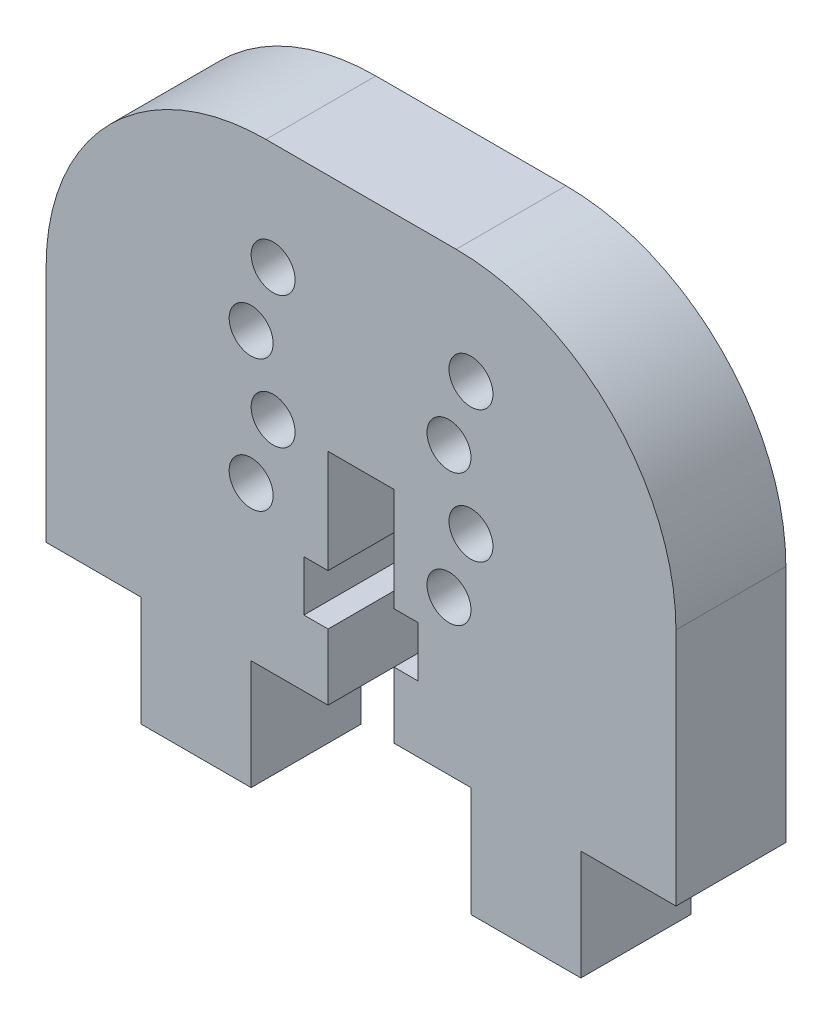
ISO-10303-21;
HEADER;
FILE_DESCRIPTION(('STEP AP214'),'2;1');
FILE_NAME('part.step','',(''),(''),'','','');
FILE_SCHEMA(('AUTOMOTIVE_DESIGN { 1 0 10303 214 1 1 1 1 }'));
ENDSEC;
DATA;
#1=APPLICATION_CONTEXT('core data for automotive mechanical design processes');
#2=APPLICATION_PROTOCOL_DEFINITION('international standard','automotive_design',2000,#1);
#3=PRODUCT_CONTEXT('',#1,'mechanical');
#4=PRODUCT('Part','Part','',(#3));
#5=PRODUCT_RELATED_PRODUCT_CATEGORY('part','',(#4));
#6=PRODUCT_DEFINITION_FORMATION('','',#4);
#7=PRODUCT_DEFINITION_CONTEXT('part definition',#1,'design');
#8=PRODUCT_DEFINITION('design','',#6,#7);
#9=PRODUCT_DEFINITION_SHAPE('','',#8);
#10=(LENGTH_UNIT() NAMED_UNIT(*) SI_UNIT(.MILLI.,.METRE.));
#11=(NAMED_UNIT(*) PLANE_ANGLE_UNIT() SI_UNIT($,.RADIAN.));
#12=(NAMED_UNIT(*) SI_UNIT($,.STERADIAN.) SOLID_ANGLE_UNIT());
#13=UNCERTAINTY_MEASURE_WITH_UNIT(LENGTH_MEASURE(1.E-05),#10,'distance_accuracy_value','');
#14=(GEOMETRIC_REPRESENTATION_CONTEXT(3) GLOBAL_UNCERTAINTY_ASSIGNED_CONTEXT((#13)) GLOBAL_UNIT_ASSIGNED_CONTEXT((#10,
#11,#12)) REPRESENTATION_CONTEXT('',''));
#15=CARTESIAN_POINT('',(0.,0.,0.));
#16=DIRECTION('',(0.,0.,1.));
#17=DIRECTION('',(1.,0.,0.));
#18=AXIS2_PLACEMENT_3D('',#15,#16,#17);
#19=CARTESIAN_POINT('',(-1.5,0.,5.));
#20=DIRECTION('',(1.,0.,0.));
#21=DIRECTION('',(0.,1.,0.));
#22=AXIS2_PLACEMENT_3D('',#19,#20,#21);
#23=PLANE('',#22);
#24=DIRECTION('',(0.,-1.,0.));
#25=VECTOR('',#24,1.);
#26=CARTESIAN_POINT('',(-1.5,0.,0.));
#27=LINE('',#26,#25);
#28=CARTESIAN_POINT('',(-1.5,-7.43799709001882,0.));
#29=VERTEX_POINT('',#28);
#30=CARTESIAN_POINT('',(-1.5,-10.4379970900188,0.));
#31=VERTEX_POINT('',#30);
#32=EDGE_CURVE('E214',#29,#31,#27,.T.);
#33=ORIENTED_EDGE('',*,*,#32,.F.);
#34=DIRECTION('',(0.,0.,-1.));
#35=VECTOR('',#34,1.);
#36=CARTESIAN_POINT('',(-1.5,-7.43799709001882,5.));
#37=LINE('',#36,#35);
#38=CARTESIAN_POINT('',(-1.5,-7.43799709001882,5.));
#39=VERTEX_POINT('',#38);
#40=EDGE_CURVE('E209',#39,#29,#37,.T.);
#41=ORIENTED_EDGE('',*,*,#40,.F.);
#42=DIRECTION('',(0.,-1.,0.));
#43=VECTOR('',#42,1.);
#44=CARTESIAN_POINT('',(-1.5,0.,5.));
#45=LINE('',#44,#43);
#46=CARTESIAN_POINT('',(-1.5,-10.4379970900188,5.));
#47=VERTEX_POINT('',#46);
#48=EDGE_CURVE('E212',#39,#47,#45,.T.);
#49=ORIENTED_EDGE('',*,*,#48,.T.);
#50=DIRECTION('',(0.,0.,-1.));
#51=VECTOR('',#50,1.);
#52=CARTESIAN_POINT('',(-1.5,-10.4379970900188,5.));
#53=LINE('',#52,#51);
#54=EDGE_CURVE('E308',#47,#31,#53,.T.);
#55=ORIENTED_EDGE('',*,*,#54,.T.);
#56=EDGE_LOOP('',(#33,#41,#49,#55));
#57=FACE_BOUND('',#56,.T.);
#58=ADVANCED_FACE('F32',(#57),#23,.T.);
#59=CARTESIAN_POINT('',(0.,-7.43799709001883,5.));
#60=DIRECTION('',(0.,-1.,0.));
#61=DIRECTION('',(1.,0.,0.));
#62=AXIS2_PLACEMENT_3D('',#59,#60,#61);
#63=PLANE('',#62);
#64=DIRECTION('',(-1.,0.,0.));
#65=VECTOR('',#64,1.);
#66=CARTESIAN_POINT('',(0.,-7.43799709001883,0.));
#67=LINE('',#66,#65);
#68=CARTESIAN_POINT('',(-2.6,-7.43799709001882,0.));
#69=VERTEX_POINT('',#68);
#70=EDGE_CURVE('E310',#29,#69,#67,.T.);
#71=ORIENTED_EDGE('',*,*,#70,.T.);
#72=DIRECTION('',(0.,0.,-1.));
#73=VECTOR('',#72,1.);
#74=CARTESIAN_POINT('',(-2.6,-7.43799709001882,5.));
#75=LINE('',#74,#73);
#76=CARTESIAN_POINT('',(-2.6,-7.43799709001882,5.));
#77=VERTEX_POINT('',#76);
#78=EDGE_CURVE('E218',#77,#69,#75,.T.);
#79=ORIENTED_EDGE('',*,*,#78,.F.);
#80=DIRECTION('',(-1.,0.,0.));
#81=VECTOR('',#80,1.);
#82=CARTESIAN_POINT('',(0.,-7.43799709001883,5.));
#83=LINE('',#82,#81);
#84=EDGE_CURVE('E221',#39,#77,#83,.T.);
#85=ORIENTED_EDGE('',*,*,#84,.F.);
#86=ORIENTED_EDGE('',*,*,#40,.T.);
#87=EDGE_LOOP('',(#71,#79,#85,#86));
#88=FACE_BOUND('',#87,.T.);
#89=ADVANCED_FACE('F222',(#88),#63,.F.);
#90=CARTESIAN_POINT('',(-2.60000000000001,0.,5.));
#91=DIRECTION('',(-1.,0.,0.));
#92=DIRECTION('',(0.,-1.,0.));
#93=AXIS2_PLACEMENT_3D('',#90,#91,#92);
#94=PLANE('',#93);
#95=DIRECTION('',(0.,1.,0.));
#96=VECTOR('',#95,1.);
#97=CARTESIAN_POINT('',(-2.60000000000001,0.,0.));
#98=LINE('',#97,#96);
#99=CARTESIAN_POINT('',(-2.6,-5.13799709001883,0.));
#100=VERTEX_POINT('',#99);
#101=EDGE_CURVE('E312',#69,#100,#98,.T.);
#102=ORIENTED_EDGE('',*,*,#101,.T.);
#103=DIRECTION('',(0.,0.,-1.));
#104=VECTOR('',#103,1.);
#105=CARTESIAN_POINT('',(-2.6,-5.13799709001883,5.));
#106=LINE('',#105,#104);
#107=CARTESIAN_POINT('',(-2.6,-5.13799709001883,5.));
#108=VERTEX_POINT('',#107);
#109=EDGE_CURVE('E428',#108,#100,#106,.T.);
#110=ORIENTED_EDGE('',*,*,#109,.F.);
#111=DIRECTION('',(0.,1.,0.));
#112=VECTOR('',#111,1.);
#113=CARTESIAN_POINT('',(-2.60000000000001,0.,5.));
#114=LINE('',#113,#112);
#115=EDGE_CURVE('E225',#77,#108,#114,.T.);
#116=ORIENTED_EDGE('',*,*,#115,.F.);
#117=ORIENTED_EDGE('',*,*,#78,.T.);
#118=EDGE_LOOP('',(#102,#110,#116,#117));
#119=FACE_BOUND('',#118,.T.);
#120=ADVANCED_FACE('F474',(#119),#94,.F.);
#121=CARTESIAN_POINT('',(0.,-5.13799709001884,5.));
#122=DIRECTION('',(0.,1.,0.));
#123=DIRECTION('',(-1.,0.,0.));
#124=AXIS2_PLACEMENT_3D('',#121,#122,#123);
#125=PLANE('',#124);
#126=DIRECTION('',(1.,0.,0.));
#127=VECTOR('',#126,1.);
#128=CARTESIAN_POINT('',(0.,-5.13799709001884,0.));
#129=LINE('',#128,#127);
#130=CARTESIAN_POINT('',(-1.5,-5.13799709001883,0.));
#131=VERTEX_POINT('',#130);
#132=EDGE_CURVE('E314',#100,#131,#129,.T.);
#133=ORIENTED_EDGE('',*,*,#132,.T.);
#134=DIRECTION('',(0.,0.,-1.));
#135=VECTOR('',#134,1.);
#136=CARTESIAN_POINT('',(-1.5,-5.13799709001883,5.));
#137=LINE('',#136,#135);
#138=CARTESIAN_POINT('',(-1.5,-5.13799709001883,5.));
#139=VERTEX_POINT('',#138);
#140=EDGE_CURVE('E426',#139,#131,#137,.T.);
#141=ORIENTED_EDGE('',*,*,#140,.F.);
#142=DIRECTION('',(1.,0.,0.));
#143=VECTOR('',#142,1.);
#144=CARTESIAN_POINT('',(0.,-5.13799709001884,5.));
#145=LINE('',#144,#143);
#146=EDGE_CURVE('E239',#108,#139,#145,.T.);
#147=ORIENTED_EDGE('',*,*,#146,.F.);
#148=ORIENTED_EDGE('',*,*,#109,.T.);
#149=EDGE_LOOP('',(#133,#141,#147,#148));
#150=FACE_BOUND('',#149,.T.);
#151=ADVANCED_FACE('F481',(#150),#125,.F.);
#152=CARTESIAN_POINT('',(-1.5,0.,5.));
#153=DIRECTION('',(1.,0.,0.));
#154=DIRECTION('',(0.,1.,0.));
#155=AXIS2_PLACEMENT_3D('',#152,#153,#154);
#156=PLANE('',#155);
#157=DIRECTION('',(0.,-1.,0.));
#158=VECTOR('',#157,1.);
#159=CARTESIAN_POINT('',(-1.5,0.,0.));
#160=LINE('',#159,#158);
#161=CARTESIAN_POINT('',(-1.5,-0.437997090018828,0.));
#162=VERTEX_POINT('',#161);
#163=EDGE_CURVE('E317',#162,#131,#160,.T.);
#164=ORIENTED_EDGE('',*,*,#163,.F.);
#165=DIRECTION('',(0.,0.,-1.));
#166=VECTOR('',#165,1.);
#167=CARTESIAN_POINT('',(-1.5,-0.437997090018828,5.));
#168=LINE('',#167,#166);
#169=CARTESIAN_POINT('',(-1.5,-0.437997090018828,5.));
#170=VERTEX_POINT('',#169);
#171=EDGE_CURVE('E424',#170,#162,#168,.T.);
#172=ORIENTED_EDGE('',*,*,#171,.F.);
#173=DIRECTION('',(0.,-1.,0.));
#174=VECTOR('',#173,1.);
#175=CARTESIAN_POINT('',(-1.5,0.,5.));
#176=LINE('',#175,#174);
#177=EDGE_CURVE('E241',#170,#139,#176,.T.);
#178=ORIENTED_EDGE('',*,*,#177,.T.);
#179=ORIENTED_EDGE('',*,*,#140,.T.);
#180=EDGE_LOOP('',(#164,#172,#178,#179));
#181=FACE_BOUND('',#180,.T.);
#182=ADVANCED_FACE('F484',(#181),#156,.T.);
#183=CARTESIAN_POINT('',(0.,-0.437997090018828,5.));
#184=DIRECTION('',(0.,-1.,0.));
#185=DIRECTION('',(0.,0.,-1.));
#186=AXIS2_PLACEMENT_3D('',#183,#184,#185);
#187=PLANE('',#186);
#188=DIRECTION('',(-1.,0.,0.));
#189=VECTOR('',#188,1.);
#190=CARTESIAN_POINT('',(0.,-0.437997090018828,0.));
#191=LINE('',#190,#189);
#192=CARTESIAN_POINT('',(1.49999999999999,-0.437997090018828,0.));
#193=VERTEX_POINT('',#192);
#194=EDGE_CURVE('E320',#193,#162,#191,.T.);
#195=ORIENTED_EDGE('',*,*,#194,.F.);
#196=DIRECTION('',(0.,0.,-1.));
#197=VECTOR('',#196,1.);
#198=CARTESIAN_POINT('',(1.49999999999999,-0.437997090018828,5.));
#199=LINE('',#198,#197);
#200=CARTESIAN_POINT('',(1.49999999999999,-0.437997090018828,5.));
#201=VERTEX_POINT('',#200);
#202=EDGE_CURVE('E422',#201,#193,#199,.T.);
#203=ORIENTED_EDGE('',*,*,#202,.F.);
#204=DIRECTION('',(-1.,0.,0.));
#205=VECTOR('',#204,1.);
#206=CARTESIAN_POINT('',(0.,-0.437997090018828,5.));
#207=LINE('',#206,#205);
#208=EDGE_CURVE('E244',#201,#170,#207,.T.);
#209=ORIENTED_EDGE('',*,*,#208,.T.);
#210=ORIENTED_EDGE('',*,*,#171,.T.);
#211=EDGE_LOOP('',(#195,#203,#209,#210));
#212=FACE_BOUND('',#211,.T.);
#213=ADVANCED_FACE('F487',(#212),#187,.T.);
#214=CARTESIAN_POINT('',(1.5,0.,5.));
#215=DIRECTION('',(-1.,0.,0.));
#216=DIRECTION('',(0.,-1.,0.));
#217=AXIS2_PLACEMENT_3D('',#214,#215,#216);
#218=PLANE('',#217);
#219=DIRECTION('',(0.,1.,0.));
#220=VECTOR('',#219,1.);
#221=CARTESIAN_POINT('',(1.5,0.,0.));
#222=LINE('',#221,#220);
#223=CARTESIAN_POINT('',(1.49999999999999,-5.13799709001883,0.));
#224=VERTEX_POINT('',#223);
#225=EDGE_CURVE('E323',#224,#193,#222,.T.);
#226=ORIENTED_EDGE('',*,*,#225,.F.);
#227=DIRECTION('',(0.,0.,-1.));
#228=VECTOR('',#227,1.);
#229=CARTESIAN_POINT('',(1.49999999999999,-5.13799709001883,5.));
#230=LINE('',#229,#228);
#231=CARTESIAN_POINT('',(1.49999999999999,-5.13799709001883,5.));
#232=VERTEX_POINT('',#231);
#233=EDGE_CURVE('E420',#232,#224,#230,.T.);
#234=ORIENTED_EDGE('',*,*,#233,.F.);
#235=DIRECTION('',(0.,1.,0.));
#236=VECTOR('',#235,1.);
#237=CARTESIAN_POINT('',(1.5,0.,5.));
#238=LINE('',#237,#236);
#239=EDGE_CURVE('E247',#232,#201,#238,.T.);
#240=ORIENTED_EDGE('',*,*,#239,.T.);
#241=ORIENTED_EDGE('',*,*,#202,.T.);
#242=EDGE_LOOP('',(#226,#234,#240,#241));
#243=FACE_BOUND('',#242,.T.);
#244=ADVANCED_FACE('F491',(#243),#218,.T.);
#245=CARTESIAN_POINT('',(0.,-5.13799709001884,5.));
#246=DIRECTION('',(0.,1.,0.));
#247=DIRECTION('',(-1.,0.,0.));
#248=AXIS2_PLACEMENT_3D('',#245,#246,#247);
#249=PLANE('',#248);
#250=DIRECTION('',(1.,0.,0.));
#251=VECTOR('',#250,1.);
#252=CARTESIAN_POINT('',(0.,-5.13799709001884,0.));
#253=LINE('',#252,#251);
#254=CARTESIAN_POINT('',(2.6,-5.13799709001883,0.));
#255=VERTEX_POINT('',#254);
#256=EDGE_CURVE('E326',#224,#255,#253,.T.);
#257=ORIENTED_EDGE('',*,*,#256,.T.);
#258=DIRECTION('',(0.,0.,-1.));
#259=VECTOR('',#258,1.);
#260=CARTESIAN_POINT('',(2.6,-5.13799709001883,5.));
#261=LINE('',#260,#259);
#262=CARTESIAN_POINT('',(2.6,-5.13799709001883,5.));
#263=VERTEX_POINT('',#262);
#264=EDGE_CURVE('E417',#263,#255,#261,.T.);
#265=ORIENTED_EDGE('',*,*,#264,.F.);
#266=DIRECTION('',(1.,0.,0.));
#267=VECTOR('',#266,1.);
#268=CARTESIAN_POINT('',(0.,-5.13799709001884,5.));
#269=LINE('',#268,#267);
#270=EDGE_CURVE('E250',#232,#263,#269,.T.);
#271=ORIENTED_EDGE('',*,*,#270,.F.);
#272=ORIENTED_EDGE('',*,*,#233,.T.);
#273=EDGE_LOOP('',(#257,#265,#271,#272));
#274=FACE_BOUND('',#273,.T.);
#275=ADVANCED_FACE('F496',(#274),#249,.F.);
#276=CARTESIAN_POINT('',(2.6,0.,5.));
#277=DIRECTION('',(1.,0.,0.));
#278=DIRECTION('',(0.,1.,0.));
#279=AXIS2_PLACEMENT_3D('',#276,#277,#278);
#280=PLANE('',#279);
#281=DIRECTION('',(0.,-1.,0.));
#282=VECTOR('',#281,1.);
#283=CARTESIAN_POINT('',(2.6,0.,0.));
#284=LINE('',#283,#282);
#285=CARTESIAN_POINT('',(2.59999999999999,-7.43799709001882,0.));
#286=VERTEX_POINT('',#285);
#287=EDGE_CURVE('E328',#255,#286,#284,.T.);
#288=ORIENTED_EDGE('',*,*,#287,.T.);
#289=DIRECTION('',(0.,0.,-1.));
#290=VECTOR('',#289,1.);
#291=CARTESIAN_POINT('',(2.59999999999999,-7.43799709001882,5.));
#292=LINE('',#291,#290);
#293=CARTESIAN_POINT('',(2.59999999999999,-7.43799709001882,5.));
#294=VERTEX_POINT('',#293);
#295=EDGE_CURVE('E414',#294,#286,#292,.T.);
#296=ORIENTED_EDGE('',*,*,#295,.F.);
#297=DIRECTION('',(0.,-1.,0.));
#298=VECTOR('',#297,1.);
#299=CARTESIAN_POINT('',(2.6,0.,5.));
#300=LINE('',#299,#298);
#301=EDGE_CURVE('E252',#263,#294,#300,.T.);
#302=ORIENTED_EDGE('',*,*,#301,.F.);
#303=ORIENTED_EDGE('',*,*,#264,.T.);
#304=EDGE_LOOP('',(#288,#296,#302,#303));
#305=FACE_BOUND('',#304,.T.);
#306=ADVANCED_FACE('F503',(#305),#280,.F.);
#307=CARTESIAN_POINT('',(0.,-7.43799709001882,5.));
#308=DIRECTION('',(0.,-1.,0.));
#309=DIRECTION('',(0.,0.,-1.));
#310=AXIS2_PLACEMENT_3D('',#307,#308,#309);
#311=PLANE('',#310);
#312=DIRECTION('',(-1.,0.,0.));
#313=VECTOR('',#312,1.);
#314=CARTESIAN_POINT('',(0.,-7.43799709001882,0.));
#315=LINE('',#314,#313);
#316=CARTESIAN_POINT('',(1.49999999999999,-7.43799709001882,0.));
#317=VERTEX_POINT('',#316);
#318=EDGE_CURVE('E330',#286,#317,#315,.T.);
#319=ORIENTED_EDGE('',*,*,#318,.T.);
#320=DIRECTION('',(0.,0.,-1.));
#321=VECTOR('',#320,1.);
#322=CARTESIAN_POINT('',(1.49999999999999,-7.43799709001882,5.));
#323=LINE('',#322,#321);
#324=CARTESIAN_POINT('',(1.49999999999999,-7.43799709001882,5.));
#325=VERTEX_POINT('',#324);
#326=EDGE_CURVE('E412',#325,#317,#323,.T.);
#327=ORIENTED_EDGE('',*,*,#326,.F.);
#328=DIRECTION('',(-1.,0.,0.));
#329=VECTOR('',#328,1.);
#330=CARTESIAN_POINT('',(0.,-7.43799709001882,5.));
#331=LINE('',#330,#329);
#332=EDGE_CURVE('E254',#294,#325,#331,.T.);
#333=ORIENTED_EDGE('',*,*,#332,.F.);
#334=ORIENTED_EDGE('',*,*,#295,.T.);
#335=EDGE_LOOP('',(#319,#327,#333,#334));
#336=FACE_BOUND('',#335,.T.);
#337=ADVANCED_FACE('F507',(#336),#311,.F.);
#338=CARTESIAN_POINT('',(1.49999999999999,0.,5.));
#339=DIRECTION('',(-1.,0.,0.));
#340=DIRECTION('',(0.,0.,1.));
#341=AXIS2_PLACEMENT_3D('',#338,#339,#340);
#342=PLANE('',#341);
#343=DIRECTION('',(0.,1.,0.));
#344=VECTOR('',#343,1.);
#345=CARTESIAN_POINT('',(1.49999999999999,0.,0.));
#346=LINE('',#345,#344);
#347=CARTESIAN_POINT('',(1.5,-10.4379970900188,0.));
#348=VERTEX_POINT('',#347);
#349=EDGE_CURVE('E333',#348,#317,#346,.T.);
#350=ORIENTED_EDGE('',*,*,#349,.F.);
#351=DIRECTION('',(0.,0.,-1.));
#352=VECTOR('',#351,1.);
#353=CARTESIAN_POINT('',(1.5,-10.4379970900188,5.));
#354=LINE('',#353,#352);
#355=CARTESIAN_POINT('',(1.5,-10.4379970900188,5.));
#356=VERTEX_POINT('',#355);
#357=EDGE_CURVE('E410',#356,#348,#354,.T.);
#358=ORIENTED_EDGE('',*,*,#357,.F.);
#359=DIRECTION('',(0.,1.,0.));
#360=VECTOR('',#359,1.);
#361=CARTESIAN_POINT('',(1.49999999999999,0.,5.));
#362=LINE('',#361,#360);
#363=EDGE_CURVE('E256',#356,#325,#362,.T.);
#364=ORIENTED_EDGE('',*,*,#363,.T.);
#365=ORIENTED_EDGE('',*,*,#326,.T.);
#366=EDGE_LOOP('',(#350,#358,#364,#365));
#367=FACE_BOUND('',#366,.T.);
#368=ADVANCED_FACE('F510',(#367),#342,.T.);
#369=CARTESIAN_POINT('',(0.,-10.4379970900188,5.));
#370=DIRECTION('',(0.,1.,0.));
#371=DIRECTION('',(0.,0.,1.));
#372=AXIS2_PLACEMENT_3D('',#369,#370,#371);
#373=PLANE('',#372);
#374=DIRECTION('',(1.,0.,0.));
#375=VECTOR('',#374,1.);
#376=CARTESIAN_POINT('',(0.,-10.4379970900188,0.));
#377=LINE('',#376,#375);
#378=CARTESIAN_POINT('',(5.,-10.4379970900188,0.));
#379=VERTEX_POINT('',#378);
#380=EDGE_CURVE('E336',#348,#379,#377,.T.);
#381=ORIENTED_EDGE('',*,*,#380,.T.);
#382=DIRECTION('',(0.,0.,-1.));
#383=VECTOR('',#382,1.);
#384=CARTESIAN_POINT('',(5.,-10.4379970900188,5.));
#385=LINE('',#384,#383);
#386=CARTESIAN_POINT('',(5.,-10.4379970900188,5.));
#387=VERTEX_POINT('',#386);
#388=EDGE_CURVE('E407',#387,#379,#385,.T.);
#389=ORIENTED_EDGE('',*,*,#388,.F.);
#390=DIRECTION('',(1.,0.,0.));
#391=VECTOR('',#390,1.);
#392=CARTESIAN_POINT('',(0.,-10.4379970900188,5.));
#393=LINE('',#392,#391);
#394=EDGE_CURVE('E259',#356,#387,#393,.T.);
#395=ORIENTED_EDGE('',*,*,#394,.F.);
#396=ORIENTED_EDGE('',*,*,#357,.T.);
#397=EDGE_LOOP('',(#381,#389,#395,#396));
#398=FACE_BOUND('',#397,.T.);
#399=ADVANCED_FACE('F516',(#398),#373,.F.);
#400=CARTESIAN_POINT('',(4.99999999999999,0.,5.));
#401=DIRECTION('',(1.,0.,0.));
#402=DIRECTION('',(0.,1.,0.));
#403=AXIS2_PLACEMENT_3D('',#400,#401,#402);
#404=PLANE('',#403);
#405=DIRECTION('',(0.,-1.,0.));
#406=VECTOR('',#405,1.);
#407=CARTESIAN_POINT('',(4.99999999999999,0.,0.));
#408=LINE('',#407,#406);
#409=CARTESIAN_POINT('',(5.,-15.4379970900188,0.));
#410=VERTEX_POINT('',#409);
#411=EDGE_CURVE('E338',#379,#410,#408,.T.);
#412=ORIENTED_EDGE('',*,*,#411,.T.);
#413=DIRECTION('',(0.,0.,-1.));
#414=VECTOR('',#413,1.);
#415=CARTESIAN_POINT('',(5.,-15.4379970900188,5.));
#416=LINE('',#415,#414);
#417=CARTESIAN_POINT('',(5.,-15.4379970900188,5.));
#418=VERTEX_POINT('',#417);
#419=EDGE_CURVE('E404',#418,#410,#416,.T.);
#420=ORIENTED_EDGE('',*,*,#419,.F.);
#421=DIRECTION('',(0.,-1.,0.));
#422=VECTOR('',#421,1.);
#423=CARTESIAN_POINT('',(4.99999999999999,0.,5.));
#424=LINE('',#423,#422);
#425=EDGE_CURVE('E261',#387,#418,#424,.T.);
#426=ORIENTED_EDGE('',*,*,#425,.F.);
#427=ORIENTED_EDGE('',*,*,#388,.T.);
#428=EDGE_LOOP('',(#412,#420,#426,#427));
#429=FACE_BOUND('',#428,.T.);
#430=ADVANCED_FACE('F520',(#429),#404,.F.);
#431=CARTESIAN_POINT('',(0.,-15.4379970900188,5.));
#432=DIRECTION('',(0.,1.,0.));
#433=DIRECTION('',(0.,0.,1.));
#434=AXIS2_PLACEMENT_3D('',#431,#432,#433);
#435=PLANE('',#434);
#436=DIRECTION('',(1.,0.,0.));
#437=VECTOR('',#436,1.);
#438=CARTESIAN_POINT('',(0.,-15.4379970900188,0.));
#439=LINE('',#438,#437);
#440=CARTESIAN_POINT('',(10.,-15.4379970900188,0.));
#441=VERTEX_POINT('',#440);
#442=EDGE_CURVE('E342',#410,#441,#439,.T.);
#443=ORIENTED_EDGE('',*,*,#442,.T.);
#444=DIRECTION('',(0.,0.,-1.));
#445=VECTOR('',#444,1.);
#446=CARTESIAN_POINT('',(10.,-15.4379970900188,5.));
#447=LINE('',#446,#445);
#448=CARTESIAN_POINT('',(10.,-15.4379970900188,5.));
#449=VERTEX_POINT('',#448);
#450=EDGE_CURVE('E401',#449,#441,#447,.T.);
#451=ORIENTED_EDGE('',*,*,#450,.F.);
#452=DIRECTION('',(1.,0.,0.));
#453=VECTOR('',#452,1.);
#454=CARTESIAN_POINT('',(0.,-15.4379970900188,5.));
#455=LINE('',#454,#453);
#456=EDGE_CURVE('E264',#418,#449,#455,.T.);
#457=ORIENTED_EDGE('',*,*,#456,.F.);
#458=ORIENTED_EDGE('',*,*,#419,.T.);
#459=EDGE_LOOP('',(#443,#451,#457,#458));
#460=FACE_BOUND('',#459,.T.);
#461=ADVANCED_FACE('F525',(#460),#435,.F.);
#462=CARTESIAN_POINT('',(10.,0.,5.));
#463=DIRECTION('',(-1.,0.,0.));
#464=DIRECTION('',(0.,0.,1.));
#465=AXIS2_PLACEMENT_3D('',#462,#463,#464);
#466=PLANE('',#465);
#467=DIRECTION('',(0.,1.,0.));
#468=VECTOR('',#467,1.);
#469=CARTESIAN_POINT('',(10.,0.,0.));
#470=LINE('',#469,#468);
#471=CARTESIAN_POINT('',(10.,-10.4379970900188,0.));
#472=VERTEX_POINT('',#471);
#473=EDGE_CURVE('E344',#441,#472,#470,.T.);
#474=ORIENTED_EDGE('',*,*,#473,.T.);
#475=DIRECTION('',(0.,0.,-1.));
#476=VECTOR('',#475,1.);
#477=CARTESIAN_POINT('',(10.,-10.4379970900188,5.));
#478=LINE('',#477,#476);
#479=CARTESIAN_POINT('',(10.,-10.4379970900188,5.));
#480=VERTEX_POINT('',#479);
#481=EDGE_CURVE('E398',#480,#472,#478,.T.);
#482=ORIENTED_EDGE('',*,*,#481,.F.);
#483=DIRECTION('',(0.,1.,0.));
#484=VECTOR('',#483,1.);
#485=CARTESIAN_POINT('',(10.,0.,5.));
#486=LINE('',#485,#484);
#487=EDGE_CURVE('E266',#449,#480,#486,.T.);
#488=ORIENTED_EDGE('',*,*,#487,.F.);
#489=ORIENTED_EDGE('',*,*,#450,.T.);
#490=EDGE_LOOP('',(#474,#482,#488,#489));
#491=FACE_BOUND('',#490,.T.);
#492=ADVANCED_FACE('F528',(#491),#466,.F.);
#493=CARTESIAN_POINT('',(14.3266626725749,-10.4379970900188,0.));
#494=VERTEX_POINT('',#493);
#495=EDGE_CURVE('E340',#472,#494,#377,.T.);
#496=ORIENTED_EDGE('',*,*,#495,.T.);
#497=DIRECTION('',(0.,0.,-1.));
#498=VECTOR('',#497,1.);
#499=CARTESIAN_POINT('',(14.3266626725749,-10.4379970900188,5.));
#500=LINE('',#499,#498);
#501=CARTESIAN_POINT('',(14.3266626725749,-10.4379970900188,5.));
#502=VERTEX_POINT('',#501);
#503=EDGE_CURVE('E395',#502,#494,#500,.T.);
#504=ORIENTED_EDGE('',*,*,#503,.F.);
#505=EDGE_CURVE('E262',#480,#502,#393,.T.);
#506=ORIENTED_EDGE('',*,*,#505,.F.);
#507=ORIENTED_EDGE('',*,*,#481,.T.);
#508=EDGE_LOOP('',(#496,#504,#506,#507));
#509=FACE_BOUND('',#508,.T.);
#510=ADVANCED_FACE('F458',(#509),#373,.F.);
#511=CARTESIAN_POINT('',(14.3266626725749,0.,5.));
#512=DIRECTION('',(-1.,0.,0.));
#513=DIRECTION('',(0.,0.,1.));
#514=AXIS2_PLACEMENT_3D('',#511,#512,#513);
#515=PLANE('',#514);
#516=DIRECTION('',(0.,1.,0.));
#517=VECTOR('',#516,1.);
#518=CARTESIAN_POINT('',(14.3266626725749,0.,0.));
#519=LINE('',#518,#517);
#520=CARTESIAN_POINT('',(14.3266626725749,0.437997090018826,0.));
#521=VERTEX_POINT('',#520);
#522=EDGE_CURVE('E346',#494,#521,#519,.T.);
#523=ORIENTED_EDGE('',*,*,#522,.T.);
#524=DIRECTION('',(0.,0.,-1.));
#525=VECTOR('',#524,1.);
#526=CARTESIAN_POINT('',(14.3266626725749,0.437997090018826,5.));
#527=LINE('',#526,#525);
#528=CARTESIAN_POINT('',(14.3266626725749,0.437997090018826,5.));
#529=VERTEX_POINT('',#528);
#530=EDGE_CURVE('E55',#521,#529,#527,.F.);
#531=ORIENTED_EDGE('',*,*,#530,.T.);
#532=DIRECTION('',(0.,1.,0.));
#533=VECTOR('',#532,1.);
#534=CARTESIAN_POINT('',(14.3266626725749,0.,5.));
#535=LINE('',#534,#533);
#536=EDGE_CURVE('E268',#502,#529,#535,.T.);
#537=ORIENTED_EDGE('',*,*,#536,.F.);
#538=ORIENTED_EDGE('',*,*,#503,.T.);
#539=EDGE_LOOP('',(#523,#531,#537,#538));
#540=FACE_BOUND('',#539,.T.);
#541=ADVANCED_FACE('F454',(#540),#515,.F.);
#542=CARTESIAN_POINT('',(0.,10.4379970900188,5.));
#543=DIRECTION('',(0.,1.,0.));
#544=DIRECTION('',(0.,0.,1.));
#545=AXIS2_PLACEMENT_3D('',#542,#543,#544);
#546=PLANE('',#545);
#547=DIRECTION('',(1.,0.,0.));
#548=VECTOR('',#547,1.);
#549=CARTESIAN_POINT('',(0.,10.4379970900188,5.));
#550=LINE('',#549,#548);
#551=CARTESIAN_POINT('',(-4.32666267257487,10.4379970900188,5.));
#552=VERTEX_POINT('',#551);
#553=CARTESIAN_POINT('',(4.32666267257487,10.4379970900188,5.));
#554=VERTEX_POINT('',#553);
#555=EDGE_CURVE('E270',#552,#554,#550,.T.);
#556=ORIENTED_EDGE('',*,*,#555,.T.);
#557=DIRECTION('',(0.,0.,-1.));
#558=VECTOR('',#557,1.);
#559=CARTESIAN_POINT('',(4.32666267257487,10.4379970900188,0.));
#560=LINE('',#559,#558);
#561=CARTESIAN_POINT('',(4.32666267257487,10.4379970900188,0.));
#562=VERTEX_POINT('',#561);
#563=EDGE_CURVE('E433',#554,#562,#560,.T.);
#564=ORIENTED_EDGE('',*,*,#563,.T.);
#565=DIRECTION('',(1.,0.,0.));
#566=VECTOR('',#565,1.);
#567=CARTESIAN_POINT('',(0.,10.4379970900188,0.));
#568=LINE('',#567,#566);
#569=CARTESIAN_POINT('',(-4.32666267257487,10.4379970900188,0.));
#570=VERTEX_POINT('',#569);
#571=EDGE_CURVE('E348',#570,#562,#568,.T.);
#572=ORIENTED_EDGE('',*,*,#571,.F.);
#573=DIRECTION('',(0.,0.,-1.));
#574=VECTOR('',#573,1.);
#575=CARTESIAN_POINT('',(-4.32666267257487,10.4379970900188,5.));
#576=LINE('',#575,#574);
#577=EDGE_CURVE('E217',#570,#552,#576,.F.);
#578=ORIENTED_EDGE('',*,*,#577,.T.);
#579=EDGE_LOOP('',(#556,#564,#572,#578));
#580=FACE_BOUND('',#579,.T.);
#581=ADVANCED_FACE('F445',(#580),#546,.T.);
#582=CARTESIAN_POINT('',(-14.3266626725749,0.,5.));
#583=DIRECTION('',(-1.,0.,0.));
#584=DIRECTION('',(0.,0.,1.));
#585=AXIS2_PLACEMENT_3D('',#582,#583,#584);
#586=PLANE('',#585);
#587=DIRECTION('',(0.,1.,0.));
#588=VECTOR('',#587,1.);
#589=CARTESIAN_POINT('',(-14.3266626725749,0.,5.));
#590=LINE('',#589,#588);
#591=CARTESIAN_POINT('',(-14.3266626725749,-10.4379970900188,5.));
#592=VERTEX_POINT('',#591);
#593=CARTESIAN_POINT('',(-14.3266626725749,0.437997090018826,5.));
#594=VERTEX_POINT('',#593);
#595=EDGE_CURVE('E273',#592,#594,#590,.T.);
#596=ORIENTED_EDGE('',*,*,#595,.T.);
#597=DIRECTION('',(0.,0.,-1.));
#598=VECTOR('',#597,1.);
#599=CARTESIAN_POINT('',(-14.3266626725749,0.437997090018826,5.));
#600=LINE('',#599,#598);
#601=CARTESIAN_POINT('',(-14.3266626725749,0.437997090018826,0.));
#602=VERTEX_POINT('',#601);
#603=EDGE_CURVE('E11',#594,#602,#600,.T.);
#604=ORIENTED_EDGE('',*,*,#603,.T.);
#605=DIRECTION('',(0.,1.,0.));
#606=VECTOR('',#605,1.);
#607=CARTESIAN_POINT('',(-14.3266626725749,0.,0.));
#608=LINE('',#607,#606);
#609=CARTESIAN_POINT('',(-14.3266626725749,-10.4379970900188,0.));
#610=VERTEX_POINT('',#609);
#611=EDGE_CURVE('E351',#610,#602,#608,.T.);
#612=ORIENTED_EDGE('',*,*,#611,.F.);
#613=DIRECTION('',(0.,0.,-1.));
#614=VECTOR('',#613,1.);
#615=CARTESIAN_POINT('',(-14.3266626725749,-10.4379970900188,5.));
#616=LINE('',#615,#614);
#617=EDGE_CURVE('E393',#592,#610,#616,.T.);
#618=ORIENTED_EDGE('',*,*,#617,.F.);
#619=EDGE_LOOP('',(#596,#604,#612,#618));
#620=FACE_BOUND('',#619,.T.);
#621=ADVANCED_FACE('F603',(#620),#586,.T.);
#622=CARTESIAN_POINT('',(-10.,-10.4379970900188,0.));
#623=VERTEX_POINT('',#622);
#624=EDGE_CURVE('E354',#610,#623,#377,.T.);
#625=ORIENTED_EDGE('',*,*,#624,.T.);
#626=DIRECTION('',(0.,0.,-1.));
#627=VECTOR('',#626,1.);
#628=CARTESIAN_POINT('',(-10.,-10.4379970900188,5.));
#629=LINE('',#628,#627);
#630=CARTESIAN_POINT('',(-10.,-10.4379970900188,5.));
#631=VERTEX_POINT('',#630);
#632=EDGE_CURVE('E391',#631,#623,#629,.T.);
#633=ORIENTED_EDGE('',*,*,#632,.F.);
#634=EDGE_CURVE('E275',#592,#631,#393,.T.);
#635=ORIENTED_EDGE('',*,*,#634,.F.);
#636=ORIENTED_EDGE('',*,*,#617,.T.);
#637=EDGE_LOOP('',(#625,#633,#635,#636));
#638=FACE_BOUND('',#637,.T.);
#639=ADVANCED_FACE('F536',(#638),#373,.F.);
#640=CARTESIAN_POINT('',(-10.,0.,5.));
#641=DIRECTION('',(-1.,0.,0.));
#642=DIRECTION('',(0.,0.,1.));
#643=AXIS2_PLACEMENT_3D('',#640,#641,#642);
#644=PLANE('',#643);
#645=DIRECTION('',(0.,1.,0.));
#646=VECTOR('',#645,1.);
#647=CARTESIAN_POINT('',(-10.,0.,0.));
#648=LINE('',#647,#646);
#649=CARTESIAN_POINT('',(-10.,-15.4379970900188,0.));
#650=VERTEX_POINT('',#649);
#651=EDGE_CURVE('E355',#650,#623,#648,.T.);
#652=ORIENTED_EDGE('',*,*,#651,.F.);
#653=DIRECTION('',(0.,0.,-1.));
#654=VECTOR('',#653,1.);
#655=CARTESIAN_POINT('',(-10.,-15.4379970900188,5.));
#656=LINE('',#655,#654);
#657=CARTESIAN_POINT('',(-10.,-15.4379970900188,5.));
#658=VERTEX_POINT('',#657);
#659=EDGE_CURVE('E389',#658,#650,#656,.T.);
#660=ORIENTED_EDGE('',*,*,#659,.F.);
#661=DIRECTION('',(0.,1.,0.));
#662=VECTOR('',#661,1.);
#663=CARTESIAN_POINT('',(-10.,0.,5.));
#664=LINE('',#663,#662);
#665=EDGE_CURVE('E276',#658,#631,#664,.T.);
#666=ORIENTED_EDGE('',*,*,#665,.T.);
#667=ORIENTED_EDGE('',*,*,#632,.T.);
#668=EDGE_LOOP('',(#652,#660,#666,#667));
#669=FACE_BOUND('',#668,.T.);
#670=ADVANCED_FACE('F598',(#669),#644,.T.);
#671=CARTESIAN_POINT('',(0.,-15.4379970900188,5.));
#672=DIRECTION('',(0.,-1.,0.));
#673=DIRECTION('',(0.,0.,-1.));
#674=AXIS2_PLACEMENT_3D('',#671,#672,#673);
#675=PLANE('',#674);
#676=DIRECTION('',(-1.,0.,0.));
#677=VECTOR('',#676,1.);
#678=CARTESIAN_POINT('',(0.,-15.4379970900188,0.));
#679=LINE('',#678,#677);
#680=CARTESIAN_POINT('',(-5.,-15.4379970900188,0.));
#681=VERTEX_POINT('',#680);
#682=EDGE_CURVE('E358',#681,#650,#679,.T.);
#683=ORIENTED_EDGE('',*,*,#682,.F.);
#684=DIRECTION('',(0.,0.,-1.));
#685=VECTOR('',#684,1.);
#686=CARTESIAN_POINT('',(-5.,-15.4379970900188,5.));
#687=LINE('',#686,#685);
#688=CARTESIAN_POINT('',(-5.,-15.4379970900188,5.));
#689=VERTEX_POINT('',#688);
#690=EDGE_CURVE('E387',#689,#681,#687,.T.);
#691=ORIENTED_EDGE('',*,*,#690,.F.);
#692=DIRECTION('',(-1.,0.,0.));
#693=VECTOR('',#692,1.);
#694=CARTESIAN_POINT('',(0.,-15.4379970900188,5.));
#695=LINE('',#694,#693);
#696=EDGE_CURVE('E279',#689,#658,#695,.T.);
#697=ORIENTED_EDGE('',*,*,#696,.T.);
#698=ORIENTED_EDGE('',*,*,#659,.T.);
#699=EDGE_LOOP('',(#683,#691,#697,#698));
#700=FACE_BOUND('',#699,.T.);
#701=ADVANCED_FACE('F594',(#700),#675,.T.);
#702=CARTESIAN_POINT('',(-5.,0.,5.));
#703=DIRECTION('',(-1.,0.,0.));
#704=DIRECTION('',(0.,-1.,0.));
#705=AXIS2_PLACEMENT_3D('',#702,#703,#704);
#706=PLANE('',#705);
#707=DIRECTION('',(0.,1.,0.));
#708=VECTOR('',#707,1.);
#709=CARTESIAN_POINT('',(-5.,0.,0.));
#710=LINE('',#709,#708);
#711=CARTESIAN_POINT('',(-5.,-10.4379970900188,0.));
#712=VERTEX_POINT('',#711);
#713=EDGE_CURVE('E361',#681,#712,#710,.T.);
#714=ORIENTED_EDGE('',*,*,#713,.T.);
#715=DIRECTION('',(0.,0.,-1.));
#716=VECTOR('',#715,1.);
#717=CARTESIAN_POINT('',(-5.,-10.4379970900188,5.));
#718=LINE('',#717,#716);
#719=CARTESIAN_POINT('',(-5.,-10.4379970900188,5.));
#720=VERTEX_POINT('',#719);
#721=EDGE_CURVE('E384',#720,#712,#718,.T.);
#722=ORIENTED_EDGE('',*,*,#721,.F.);
#723=DIRECTION('',(0.,1.,0.));
#724=VECTOR('',#723,1.);
#725=CARTESIAN_POINT('',(-5.,0.,5.));
#726=LINE('',#725,#724);
#727=EDGE_CURVE('E282',#689,#720,#726,.T.);
#728=ORIENTED_EDGE('',*,*,#727,.F.);
#729=ORIENTED_EDGE('',*,*,#690,.T.);
#730=EDGE_LOOP('',(#714,#722,#728,#729));
#731=FACE_BOUND('',#730,.T.);
#732=ADVANCED_FACE('F566',(#731),#706,.F.);
#733=CARTESIAN_POINT('',(-4.,-0.43799709001883,5.));
#734=DIRECTION('',(0.,0.,-1.));
#735=DIRECTION('',(-1.,0.,0.));
#736=AXIS2_PLACEMENT_3D('',#733,#734,#735);
#737=CYLINDRICAL_SURFACE('',#736,1.);
#738=CARTESIAN_POINT('',(-4.,-0.43799709001883,5.));
#739=DIRECTION('',(0.,0.,1.));
#740=DIRECTION('',(1.,0.,0.));
#741=AXIS2_PLACEMENT_3D('',#738,#739,#740);
#742=CIRCLE('',#741,1.);
#743=CARTESIAN_POINT('',(-3.,-0.43799709001883,5.));
#744=VERTEX_POINT('',#743);
#745=EDGE_CURVE('E302',#744,#744,#742,.T.);
#746=ORIENTED_EDGE('',*,*,#745,.T.);
#747=EDGE_LOOP('',(#746));
#748=FACE_BOUND('',#747,.T.);
#749=CARTESIAN_POINT('',(-4.,-0.43799709001883,0.));
#750=DIRECTION('',(0.,0.,1.));
#751=DIRECTION('',(1.,0.,0.));
#752=AXIS2_PLACEMENT_3D('',#749,#750,#751);
#753=CIRCLE('',#752,1.);
#754=CARTESIAN_POINT('',(-3.,-0.43799709001883,0.));
#755=VERTEX_POINT('',#754);
#756=EDGE_CURVE('E235',#755,#755,#753,.T.);
#757=ORIENTED_EDGE('',*,*,#756,.F.);
#758=EDGE_LOOP('',(#757));
#759=FACE_BOUND('',#758,.T.);
#760=ADVANCED_FACE('F562',(#748,#759),#737,.F.);
#761=CARTESIAN_POINT('',(-5.00000000000001,2.56200290998117,5.));
#762=DIRECTION('',(0.,0.,-1.));
#763=DIRECTION('',(-1.,0.,0.));
#764=AXIS2_PLACEMENT_3D('',#761,#762,#763);
#765=CYLINDRICAL_SURFACE('',#764,1.);
#766=CARTESIAN_POINT('',(-5.00000000000001,2.56200290998117,5.));
#767=DIRECTION('',(0.,0.,1.));
#768=DIRECTION('',(1.,0.,0.));
#769=AXIS2_PLACEMENT_3D('',#766,#767,#768);
#770=CIRCLE('',#769,1.);
#771=CARTESIAN_POINT('',(-4.00000000000001,2.56200290998117,5.));
#772=VERTEX_POINT('',#771);
#773=EDGE_CURVE('E299',#772,#772,#770,.T.);
#774=ORIENTED_EDGE('',*,*,#773,.T.);
#775=EDGE_LOOP('',(#774));
#776=FACE_BOUND('',#775,.T.);
#777=CARTESIAN_POINT('',(-5.00000000000001,2.56200290998117,0.));
#778=DIRECTION('',(0.,0.,1.));
#779=DIRECTION('',(1.,0.,0.));
#780=AXIS2_PLACEMENT_3D('',#777,#778,#779);
#781=CIRCLE('',#780,1.);
#782=CARTESIAN_POINT('',(-4.00000000000001,2.56200290998117,0.));
#783=VERTEX_POINT('',#782);
#784=EDGE_CURVE('E378',#783,#783,#781,.T.);
#785=ORIENTED_EDGE('',*,*,#784,.F.);
#786=EDGE_LOOP('',(#785));
#787=FACE_BOUND('',#786,.T.);
#788=ADVANCED_FACE('F565',(#776,#787),#765,.F.);
#789=CARTESIAN_POINT('',(-4.00000000000001,5.56200290998117,5.));
#790=DIRECTION('',(0.,0.,-1.));
#791=DIRECTION('',(-1.,0.,0.));
#792=AXIS2_PLACEMENT_3D('',#789,#790,#791);
#793=CYLINDRICAL_SURFACE('',#792,1.);
#794=CARTESIAN_POINT('',(-4.00000000000001,5.56200290998117,5.));
#795=DIRECTION('',(0.,0.,1.));
#796=DIRECTION('',(1.,0.,0.));
#797=AXIS2_PLACEMENT_3D('',#794,#795,#796);
#798=CIRCLE('',#797,1.);
#799=CARTESIAN_POINT('',(-3.,5.56200290998117,5.));
#800=VERTEX_POINT('',#799);
#801=EDGE_CURVE('E296',#800,#800,#798,.T.);
#802=ORIENTED_EDGE('',*,*,#801,.T.);
#803=EDGE_LOOP('',(#802));
#804=FACE_BOUND('',#803,.T.);
#805=CARTESIAN_POINT('',(-4.00000000000001,5.56200290998117,0.));
#806=DIRECTION('',(0.,0.,1.));
#807=DIRECTION('',(1.,0.,0.));
#808=AXIS2_PLACEMENT_3D('',#805,#806,#807);
#809=CIRCLE('',#808,1.);
#810=CARTESIAN_POINT('',(-3.,5.56200290998117,0.));
#811=VERTEX_POINT('',#810);
#812=EDGE_CURVE('E375',#811,#811,#809,.T.);
#813=ORIENTED_EDGE('',*,*,#812,.F.);
#814=EDGE_LOOP('',(#813));
#815=FACE_BOUND('',#814,.T.);
#816=ADVANCED_FACE('F570',(#804,#815),#793,.F.);
#817=CARTESIAN_POINT('',(3.99999999999999,-3.43799709001883,5.));
#818=DIRECTION('',(0.,0.,-1.));
#819=DIRECTION('',(-1.,0.,0.));
#820=AXIS2_PLACEMENT_3D('',#817,#818,#819);
#821=CYLINDRICAL_SURFACE('',#820,1.);
#822=CARTESIAN_POINT('',(3.99999999999999,-3.43799709001883,5.));
#823=DIRECTION('',(0.,0.,1.));
#824=DIRECTION('',(1.,0.,0.));
#825=AXIS2_PLACEMENT_3D('',#822,#823,#824);
#826=CIRCLE('',#825,1.);
#827=CARTESIAN_POINT('',(4.99999999999999,-3.43799709001883,5.));
#828=VERTEX_POINT('',#827);
#829=EDGE_CURVE('E293',#828,#828,#826,.T.);
#830=ORIENTED_EDGE('',*,*,#829,.T.);
#831=EDGE_LOOP('',(#830));
#832=FACE_BOUND('',#831,.T.);
#833=CARTESIAN_POINT('',(3.99999999999999,-3.43799709001883,0.));
#834=DIRECTION('',(0.,0.,1.));
#835=DIRECTION('',(1.,0.,0.));
#836=AXIS2_PLACEMENT_3D('',#833,#834,#835);
#837=CIRCLE('',#836,1.);
#838=CARTESIAN_POINT('',(4.99999999999999,-3.43799709001883,0.));
#839=VERTEX_POINT('',#838);
#840=EDGE_CURVE('E372',#839,#839,#837,.T.);
#841=ORIENTED_EDGE('',*,*,#840,.F.);
#842=EDGE_LOOP('',(#841));
#843=FACE_BOUND('',#842,.T.);
#844=ADVANCED_FACE('F574',(#832,#843),#821,.F.);
#845=CARTESIAN_POINT('',(4.99999999999999,-0.437997090018831,5.));
#846=DIRECTION('',(0.,0.,-1.));
#847=DIRECTION('',(-1.,0.,0.));
#848=AXIS2_PLACEMENT_3D('',#845,#846,#847);
#849=CYLINDRICAL_SURFACE('',#848,1.);
#850=CARTESIAN_POINT('',(4.99999999999999,-0.437997090018831,5.));
#851=DIRECTION('',(0.,0.,1.));
#852=DIRECTION('',(1.,0.,0.));
#853=AXIS2_PLACEMENT_3D('',#850,#851,#852);
#854=CIRCLE('',#853,1.);
#855=CARTESIAN_POINT('',(5.99999999999999,-0.437997090018831,5.));
#856=VERTEX_POINT('',#855);
#857=EDGE_CURVE('E290',#856,#856,#854,.T.);
#858=ORIENTED_EDGE('',*,*,#857,.T.);
#859=EDGE_LOOP('',(#858));
#860=FACE_BOUND('',#859,.T.);
#861=CARTESIAN_POINT('',(4.99999999999999,-0.437997090018831,0.));
#862=DIRECTION('',(0.,0.,1.));
#863=DIRECTION('',(1.,0.,0.));
#864=AXIS2_PLACEMENT_3D('',#861,#862,#863);
#865=CIRCLE('',#864,1.);
#866=CARTESIAN_POINT('',(5.99999999999999,-0.437997090018831,0.));
#867=VERTEX_POINT('',#866);
#868=EDGE_CURVE('E369',#867,#867,#865,.T.);
#869=ORIENTED_EDGE('',*,*,#868,.F.);
#870=EDGE_LOOP('',(#869));
#871=FACE_BOUND('',#870,.T.);
#872=ADVANCED_FACE('F578',(#860,#871),#849,.F.);
#873=CARTESIAN_POINT('',(3.99999999999999,2.56200290998117,5.));
#874=DIRECTION('',(0.,0.,-1.));
#875=DIRECTION('',(-1.,0.,0.));
#876=AXIS2_PLACEMENT_3D('',#873,#874,#875);
#877=CYLINDRICAL_SURFACE('',#876,1.);
#878=CARTESIAN_POINT('',(3.99999999999999,2.56200290998117,5.));
#879=DIRECTION('',(0.,0.,1.));
#880=DIRECTION('',(1.,0.,0.));
#881=AXIS2_PLACEMENT_3D('',#878,#879,#880);
#882=CIRCLE('',#881,1.);
#883=CARTESIAN_POINT('',(4.99999999999999,2.56200290998117,5.));
#884=VERTEX_POINT('',#883);
#885=EDGE_CURVE('E287',#884,#884,#882,.T.);
#886=ORIENTED_EDGE('',*,*,#885,.T.);
#887=EDGE_LOOP('',(#886));
#888=FACE_BOUND('',#887,.T.);
#889=CARTESIAN_POINT('',(3.99999999999999,2.56200290998117,0.));
#890=DIRECTION('',(0.,0.,1.));
#891=DIRECTION('',(1.,0.,0.));
#892=AXIS2_PLACEMENT_3D('',#889,#890,#891);
#893=CIRCLE('',#892,1.);
#894=CARTESIAN_POINT('',(4.99999999999999,2.56200290998117,0.));
#895=VERTEX_POINT('',#894);
#896=EDGE_CURVE('E366',#895,#895,#893,.T.);
#897=ORIENTED_EDGE('',*,*,#896,.F.);
#898=EDGE_LOOP('',(#897));
#899=FACE_BOUND('',#898,.T.);
#900=ADVANCED_FACE('F582',(#888,#899),#877,.F.);
#901=CARTESIAN_POINT('',(4.99999999999999,5.56200290998117,5.));
#902=DIRECTION('',(0.,0.,-1.));
#903=DIRECTION('',(-1.,0.,0.));
#904=AXIS2_PLACEMENT_3D('',#901,#902,#903);
#905=CYLINDRICAL_SURFACE('',#904,1.);
#906=CARTESIAN_POINT('',(4.99999999999999,5.56200290998117,5.));
#907=DIRECTION('',(0.,0.,1.));
#908=DIRECTION('',(1.,0.,0.));
#909=AXIS2_PLACEMENT_3D('',#906,#907,#908);
#910=CIRCLE('',#909,1.);
#911=CARTESIAN_POINT('',(5.99999999999999,5.56200290998117,5.));
#912=VERTEX_POINT('',#911);
#913=EDGE_CURVE('E284',#912,#912,#910,.T.);
#914=ORIENTED_EDGE('',*,*,#913,.T.);
#915=EDGE_LOOP('',(#914));
#916=FACE_BOUND('',#915,.T.);
#917=CARTESIAN_POINT('',(4.99999999999999,5.56200290998117,0.));
#918=DIRECTION('',(0.,0.,1.));
#919=DIRECTION('',(1.,0.,0.));
#920=AXIS2_PLACEMENT_3D('',#917,#918,#919);
#921=CIRCLE('',#920,1.);
#922=CARTESIAN_POINT('',(5.99999999999999,5.56200290998117,0.));
#923=VERTEX_POINT('',#922);
#924=EDGE_CURVE('E363',#923,#923,#921,.T.);
#925=ORIENTED_EDGE('',*,*,#924,.F.);
#926=EDGE_LOOP('',(#925));
#927=FACE_BOUND('',#926,.T.);
#928=ADVANCED_FACE('F586',(#916,#927),#905,.F.);
#929=EDGE_CURVE('E339',#712,#31,#377,.T.);
#930=ORIENTED_EDGE('',*,*,#929,.T.);
#931=ORIENTED_EDGE('',*,*,#54,.F.);
#932=EDGE_CURVE('E230',#720,#47,#393,.T.);
#933=ORIENTED_EDGE('',*,*,#932,.F.);
#934=ORIENTED_EDGE('',*,*,#721,.T.);
#935=EDGE_LOOP('',(#930,#931,#933,#934));
#936=FACE_BOUND('',#935,.T.);
#937=ADVANCED_FACE('F468',(#936),#373,.F.);
#938=CARTESIAN_POINT('',(-5.,-3.43799709001883,5.));
#939=DIRECTION('',(0.,0.,-1.));
#940=DIRECTION('',(-1.,0.,0.));
#941=AXIS2_PLACEMENT_3D('',#938,#939,#940);
#942=CYLINDRICAL_SURFACE('',#941,1.);
#943=CARTESIAN_POINT('',(-5.,-3.43799709001883,5.));
#944=DIRECTION('',(0.,0.,1.));
#945=DIRECTION('',(1.,0.,0.));
#946=AXIS2_PLACEMENT_3D('',#943,#944,#945);
#947=CIRCLE('',#946,1.);
#948=CARTESIAN_POINT('',(-4.,-3.43799709001883,5.));
#949=VERTEX_POINT('',#948);
#950=EDGE_CURVE('E305',#949,#949,#947,.T.);
#951=ORIENTED_EDGE('',*,*,#950,.T.);
#952=EDGE_LOOP('',(#951));
#953=FACE_BOUND('',#952,.T.);
#954=CARTESIAN_POINT('',(-5.,-3.43799709001883,0.));
#955=DIRECTION('',(0.,0.,1.));
#956=DIRECTION('',(1.,0.,0.));
#957=AXIS2_PLACEMENT_3D('',#954,#955,#956);
#958=CIRCLE('',#957,1.);
#959=CARTESIAN_POINT('',(-4.,-3.43799709001883,0.));
#960=VERTEX_POINT('',#959);
#961=EDGE_CURVE('E232',#960,#960,#958,.T.);
#962=ORIENTED_EDGE('',*,*,#961,.F.);
#963=EDGE_LOOP('',(#962));
#964=FACE_BOUND('',#963,.T.);
#965=ADVANCED_FACE('F556',(#953,#964),#942,.F.);
#966=CARTESIAN_POINT('',(0.,0.,5.));
#967=DIRECTION('',(0.,0.,1.));
#968=DIRECTION('',(1.,0.,0.));
#969=AXIS2_PLACEMENT_3D('',#966,#967,#968);
#970=PLANE('',#969);
#971=ORIENTED_EDGE('',*,*,#536,.T.);
#972=CARTESIAN_POINT('',(4.32666267257487,0.437997090018826,5.));
#973=DIRECTION('',(0.,0.,1.));
#974=DIRECTION('',(1.,0.,0.));
#975=AXIS2_PLACEMENT_3D('',#972,#973,#974);
#976=CIRCLE('',#975,10.);
#977=EDGE_CURVE('E40',#529,#554,#976,.T.);
#978=ORIENTED_EDGE('',*,*,#977,.T.);
#979=ORIENTED_EDGE('',*,*,#555,.F.);
#980=CARTESIAN_POINT('',(-4.32666267257487,0.437997090018826,5.));
#981=DIRECTION('',(0.,0.,1.));
#982=DIRECTION('',(1.,0.,0.));
#983=AXIS2_PLACEMENT_3D('',#980,#981,#982);
#984=CIRCLE('',#983,10.);
#985=EDGE_CURVE('E47',#552,#594,#984,.T.);
#986=ORIENTED_EDGE('',*,*,#985,.T.);
#987=ORIENTED_EDGE('',*,*,#595,.F.);
#988=ORIENTED_EDGE('',*,*,#634,.T.);
#989=ORIENTED_EDGE('',*,*,#665,.F.);
#990=ORIENTED_EDGE('',*,*,#696,.F.);
#991=ORIENTED_EDGE('',*,*,#727,.T.);
#992=ORIENTED_EDGE('',*,*,#932,.T.);
#993=ORIENTED_EDGE('',*,*,#48,.F.);
#994=ORIENTED_EDGE('',*,*,#84,.T.);
#995=ORIENTED_EDGE('',*,*,#115,.T.);
#996=ORIENTED_EDGE('',*,*,#146,.T.);
#997=ORIENTED_EDGE('',*,*,#177,.F.);
#998=ORIENTED_EDGE('',*,*,#208,.F.);
#999=ORIENTED_EDGE('',*,*,#239,.F.);
#1000=ORIENTED_EDGE('',*,*,#270,.T.);
#1001=ORIENTED_EDGE('',*,*,#301,.T.);
#1002=ORIENTED_EDGE('',*,*,#332,.T.);
#1003=ORIENTED_EDGE('',*,*,#363,.F.);
#1004=ORIENTED_EDGE('',*,*,#394,.T.);
#1005=ORIENTED_EDGE('',*,*,#425,.T.);
#1006=ORIENTED_EDGE('',*,*,#456,.T.);
#1007=ORIENTED_EDGE('',*,*,#487,.T.);
#1008=ORIENTED_EDGE('',*,*,#505,.T.);
#1009=EDGE_LOOP('',(#971,#978,#979,#986,#987,#988,#989,#990,#991,#992,#993,#994,#995,#996,#997,
#998,#999,#1000,#1001,#1002,#1003,#1004,#1005,#1006,#1007,#1008));
#1010=FACE_BOUND('',#1009,.T.);
#1011=ORIENTED_EDGE('',*,*,#913,.F.);
#1012=EDGE_LOOP('',(#1011));
#1013=FACE_BOUND('',#1012,.T.);
#1014=ORIENTED_EDGE('',*,*,#885,.F.);
#1015=EDGE_LOOP('',(#1014));
#1016=FACE_BOUND('',#1015,.T.);
#1017=ORIENTED_EDGE('',*,*,#857,.F.);
#1018=EDGE_LOOP('',(#1017));
#1019=FACE_BOUND('',#1018,.T.);
#1020=ORIENTED_EDGE('',*,*,#829,.F.);
#1021=EDGE_LOOP('',(#1020));
#1022=FACE_BOUND('',#1021,.T.);
#1023=ORIENTED_EDGE('',*,*,#801,.F.);
#1024=EDGE_LOOP('',(#1023));
#1025=FACE_BOUND('',#1024,.T.);
#1026=ORIENTED_EDGE('',*,*,#773,.F.);
#1027=EDGE_LOOP('',(#1026));
#1028=FACE_BOUND('',#1027,.T.);
#1029=ORIENTED_EDGE('',*,*,#745,.F.);
#1030=EDGE_LOOP('',(#1029));
#1031=FACE_BOUND('',#1030,.T.);
#1032=ORIENTED_EDGE('',*,*,#950,.F.);
#1033=EDGE_LOOP('',(#1032));
#1034=FACE_BOUND('',#1033,.T.);
#1035=ADVANCED_FACE('F227',(#1010,#1013,#1016,#1019,#1022,#1025,#1028,#1031,#1034),#970,.T.);
#1036=CARTESIAN_POINT('',(0.,0.,0.));
#1037=DIRECTION('',(0.,0.,1.));
#1038=DIRECTION('',(1.,0.,0.));
#1039=AXIS2_PLACEMENT_3D('',#1036,#1037,#1038);
#1040=PLANE('',#1039);
#1041=ORIENTED_EDGE('',*,*,#571,.T.);
#1042=CARTESIAN_POINT('',(4.32666267257487,0.437997090018826,0.));
#1043=DIRECTION('',(0.,0.,1.));
#1044=DIRECTION('',(1.,0.,0.));
#1045=AXIS2_PLACEMENT_3D('',#1042,#1043,#1044);
#1046=CIRCLE('',#1045,10.);
#1047=EDGE_CURVE('E438',#562,#521,#1046,.F.);
#1048=ORIENTED_EDGE('',*,*,#1047,.T.);
#1049=ORIENTED_EDGE('',*,*,#522,.F.);
#1050=ORIENTED_EDGE('',*,*,#495,.F.);
#1051=ORIENTED_EDGE('',*,*,#473,.F.);
#1052=ORIENTED_EDGE('',*,*,#442,.F.);
#1053=ORIENTED_EDGE('',*,*,#411,.F.);
#1054=ORIENTED_EDGE('',*,*,#380,.F.);
#1055=ORIENTED_EDGE('',*,*,#349,.T.);
#1056=ORIENTED_EDGE('',*,*,#318,.F.);
#1057=ORIENTED_EDGE('',*,*,#287,.F.);
#1058=ORIENTED_EDGE('',*,*,#256,.F.);
#1059=ORIENTED_EDGE('',*,*,#225,.T.);
#1060=ORIENTED_EDGE('',*,*,#194,.T.);
#1061=ORIENTED_EDGE('',*,*,#163,.T.);
#1062=ORIENTED_EDGE('',*,*,#132,.F.);
#1063=ORIENTED_EDGE('',*,*,#101,.F.);
#1064=ORIENTED_EDGE('',*,*,#70,.F.);
#1065=ORIENTED_EDGE('',*,*,#32,.T.);
#1066=ORIENTED_EDGE('',*,*,#929,.F.);
#1067=ORIENTED_EDGE('',*,*,#713,.F.);
#1068=ORIENTED_EDGE('',*,*,#682,.T.);
#1069=ORIENTED_EDGE('',*,*,#651,.T.);
#1070=ORIENTED_EDGE('',*,*,#624,.F.);
#1071=ORIENTED_EDGE('',*,*,#611,.T.);
#1072=CARTESIAN_POINT('',(-4.32666267257487,0.437997090018826,0.));
#1073=DIRECTION('',(0.,0.,1.));
#1074=DIRECTION('',(1.,0.,0.));
#1075=AXIS2_PLACEMENT_3D('',#1072,#1073,#1074);
#1076=CIRCLE('',#1075,10.);
#1077=EDGE_CURVE('E436',#602,#570,#1076,.F.);
#1078=ORIENTED_EDGE('',*,*,#1077,.T.);
#1079=EDGE_LOOP('',(#1041,#1048,#1049,#1050,#1051,#1052,#1053,#1054,#1055,#1056,#1057,#1058,
#1059,#1060,#1061,#1062,#1063,#1064,#1065,#1066,#1067,#1068,#1069,#1070,#1071,#1078));
#1080=FACE_BOUND('',#1079,.T.);
#1081=ORIENTED_EDGE('',*,*,#924,.T.);
#1082=EDGE_LOOP('',(#1081));
#1083=FACE_BOUND('',#1082,.T.);
#1084=ORIENTED_EDGE('',*,*,#896,.T.);
#1085=EDGE_LOOP('',(#1084));
#1086=FACE_BOUND('',#1085,.T.);
#1087=ORIENTED_EDGE('',*,*,#868,.T.);
#1088=EDGE_LOOP('',(#1087));
#1089=FACE_BOUND('',#1088,.T.);
#1090=ORIENTED_EDGE('',*,*,#840,.T.);
#1091=EDGE_LOOP('',(#1090));
#1092=FACE_BOUND('',#1091,.T.);
#1093=ORIENTED_EDGE('',*,*,#812,.T.);
#1094=EDGE_LOOP('',(#1093));
#1095=FACE_BOUND('',#1094,.T.);
#1096=ORIENTED_EDGE('',*,*,#784,.T.);
#1097=EDGE_LOOP('',(#1096));
#1098=FACE_BOUND('',#1097,.T.);
#1099=ORIENTED_EDGE('',*,*,#756,.T.);
#1100=EDGE_LOOP('',(#1099));
#1101=FACE_BOUND('',#1100,.T.);
#1102=ORIENTED_EDGE('',*,*,#961,.T.);
#1103=EDGE_LOOP('',(#1102));
#1104=FACE_BOUND('',#1103,.T.);
#1105=ADVANCED_FACE('F451',(#1080,#1083,#1086,#1089,#1092,#1095,#1098,#1101,#1104),#1040,.F.);
#1106=CARTESIAN_POINT('',(4.32666267257487,0.437997090018826,5.));
#1107=DIRECTION('',(0.,0.,1.));
#1108=DIRECTION('',(1.,0.,0.));
#1109=AXIS2_PLACEMENT_3D('',#1106,#1107,#1108);
#1110=CYLINDRICAL_SURFACE('',#1109,10.);
#1111=ORIENTED_EDGE('',*,*,#977,.F.);
#1112=ORIENTED_EDGE('',*,*,#530,.F.);
#1113=ORIENTED_EDGE('',*,*,#1047,.F.);
#1114=ORIENTED_EDGE('',*,*,#563,.F.);
#1115=EDGE_LOOP('',(#1111,#1112,#1113,#1114));
#1116=FACE_BOUND('',#1115,.T.);
#1117=ADVANCED_FACE('F448',(#1116),#1110,.T.);
#1118=CARTESIAN_POINT('',(-4.32666267257487,0.437997090018826,5.));
#1119=DIRECTION('',(0.,0.,-1.));
#1120=DIRECTION('',(-1.,0.,0.));
#1121=AXIS2_PLACEMENT_3D('',#1118,#1119,#1120);
#1122=CYLINDRICAL_SURFACE('',#1121,10.);
#1123=ORIENTED_EDGE('',*,*,#985,.F.);
#1124=ORIENTED_EDGE('',*,*,#577,.F.);
#1125=ORIENTED_EDGE('',*,*,#1077,.F.);
#1126=ORIENTED_EDGE('',*,*,#603,.F.);
#1127=EDGE_LOOP('',(#1123,#1124,#1125,#1126));
#1128=FACE_BOUND('',#1127,.T.);
#1129=ADVANCED_FACE('F34',(#1128),#1122,.T.);
#1130=CLOSED_SHELL('',(#58,#89,#120,#151,#182,#213,#244,#275,#306,#337,#368,#399,#430,#461,#492,
#510,#541,#581,#621,#639,#670,#701,#732,#760,#788,#816,#844,#872,#900,#928,#937,#965,#1035,
#1105,#1117,#1129));
#1131=MANIFOLD_SOLID_BREP('B2',#1130);
#1132=ADVANCED_BREP_SHAPE_REPRESENTATION('',(#18,#1131),#14);
#1133=SHAPE_DEFINITION_REPRESENTATION(#9,#1132);
ENDSEC;
END-ISO-10303-21;
